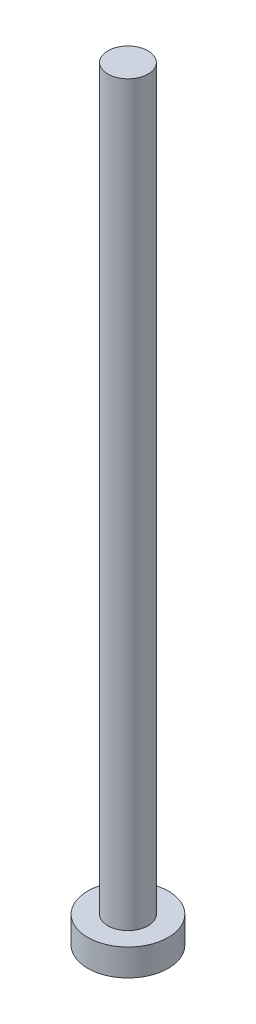
ISO-10303-21;
HEADER;
FILE_DESCRIPTION(('STEP AP214'),'2;1');
FILE_NAME('part.step','',(''),(''),'','','');
FILE_SCHEMA(('AUTOMOTIVE_DESIGN { 1 0 10303 214 1 1 1 1 }'));
ENDSEC;
DATA;
#1=APPLICATION_CONTEXT('core data for automotive mechanical design processes');
#2=APPLICATION_PROTOCOL_DEFINITION('international standard','automotive_design',2000,#1);
#3=PRODUCT_CONTEXT('',#1,'mechanical');
#4=PRODUCT('Part','Part','',(#3));
#5=PRODUCT_RELATED_PRODUCT_CATEGORY('part','',(#4));
#6=PRODUCT_DEFINITION_FORMATION('','',#4);
#7=PRODUCT_DEFINITION_CONTEXT('part definition',#1,'design');
#8=PRODUCT_DEFINITION('design','',#6,#7);
#9=PRODUCT_DEFINITION_SHAPE('','',#8);
#10=(LENGTH_UNIT() NAMED_UNIT(*) SI_UNIT(.MILLI.,.METRE.));
#11=(NAMED_UNIT(*) PLANE_ANGLE_UNIT() SI_UNIT($,.RADIAN.));
#12=(NAMED_UNIT(*) SI_UNIT($,.STERADIAN.) SOLID_ANGLE_UNIT());
#13=UNCERTAINTY_MEASURE_WITH_UNIT(LENGTH_MEASURE(1.E-05),#10,'distance_accuracy_value','');
#14=(GEOMETRIC_REPRESENTATION_CONTEXT(3) GLOBAL_UNCERTAINTY_ASSIGNED_CONTEXT((#13)) GLOBAL_UNIT_ASSIGNED_CONTEXT((#10,
#11,#12)) REPRESENTATION_CONTEXT('',''));
#15=CARTESIAN_POINT('',(0.,0.,0.));
#16=DIRECTION('',(0.,0.,1.));
#17=DIRECTION('',(1.,0.,0.));
#18=AXIS2_PLACEMENT_3D('',#15,#16,#17);
#19=CARTESIAN_POINT('',(37.8454585012872,-7.00000005030032,-40.));
#20=DIRECTION('',(-4.99382002763777E-12,-1.,8.11648050852432E-10));
#21=DIRECTION('',(0.,-8.11648050852432E-10,-1.));
#22=AXIS2_PLACEMENT_3D('',#19,#20,#21);
#23=PLANE('',#22);
#24=CARTESIAN_POINT('',(37.8454585012872,-7.00000005030033,-40.));
#25=DIRECTION('',(4.99398489789618E-12,1.,-8.11647698318666E-10));
#26=DIRECTION('',(0.,8.11647698318666E-10,1.));
#27=AXIS2_PLACEMENT_3D('',#24,#25,#26);
#28=CIRCLE('',#27,3.);
#29=CARTESIAN_POINT('',(37.8454585012872,-7.00000004786539,-37.));
#30=VERTEX_POINT('',#29);
#31=EDGE_CURVE('E18',#30,#30,#28,.T.);
#32=ORIENTED_EDGE('',*,*,#31,.F.);
#33=EDGE_LOOP('',(#32));
#34=FACE_BOUND('',#33,.T.);
#35=ADVANCED_FACE('F15',(#34),#23,.T.);
#36=CARTESIAN_POINT('',(37.8454585012872,-7.00000005030032,-40.));
#37=DIRECTION('',(4.99398489789618E-12,1.,-8.11647698318666E-10));
#38=DIRECTION('',(0.,8.11647698318666E-10,1.));
#39=AXIS2_PLACEMENT_3D('',#36,#37,#38);
#40=CYLINDRICAL_SURFACE('',#39,3.);
#41=ORIENTED_EDGE('',*,*,#31,.T.);
#42=EDGE_LOOP('',(#41));
#43=FACE_BOUND('',#42,.T.);
#44=CARTESIAN_POINT('',(37.8454585012972,-5.0000000010064,-40.0000000016233));
#45=DIRECTION('',(4.99398489789618E-12,1.,-8.11647698318666E-10));
#46=DIRECTION('',(0.,8.11647698318666E-10,1.));
#47=AXIS2_PLACEMENT_3D('',#44,#45,#46);
#48=CIRCLE('',#47,3.);
#49=CARTESIAN_POINT('',(37.8454585012972,-4.99999999857146,-37.0000000016233));
#50=VERTEX_POINT('',#49);
#51=EDGE_CURVE('E27',#50,#50,#48,.F.);
#52=ORIENTED_EDGE('',*,*,#51,.T.);
#53=EDGE_LOOP('',(#52));
#54=FACE_BOUND('',#53,.T.);
#55=ADVANCED_FACE('F35',(#43,#54),#40,.T.);
#56=CARTESIAN_POINT('',(37.8454585012873,-5.,-40.));
#57=DIRECTION('',(0.,-1.,0.));
#58=DIRECTION('',(1.,0.,0.));
#59=AXIS2_PLACEMENT_3D('',#56,#57,#58);
#60=PLANE('',#59);
#61=CARTESIAN_POINT('',(37.8454585010125,-5.0000000503002,-39.9999999553594));
#62=DIRECTION('',(-4.9937427930176E-12,-1.,8.11647960962215E-10));
#63=DIRECTION('',(0.,-8.11647960962215E-10,-1.));
#64=AXIS2_PLACEMENT_3D('',#61,#62,#63);
#65=CIRCLE('',#64,1.5);
#66=CARTESIAN_POINT('',(37.8454585010125,-5.00000005151767,-41.4999999553594));
#67=VERTEX_POINT('',#66);
#68=EDGE_CURVE('E22',#67,#67,#65,.F.);
#69=ORIENTED_EDGE('',*,*,#68,.F.);
#70=EDGE_LOOP('',(#69));
#71=FACE_BOUND('',#70,.T.);
#72=ORIENTED_EDGE('',*,*,#51,.F.);
#73=EDGE_LOOP('',(#72));
#74=FACE_BOUND('',#73,.T.);
#75=ADVANCED_FACE('F42',(#71,#74),#60,.F.);
#76=CARTESIAN_POINT('',(37.8454585012872,49.9999999496998,-40.));
#77=DIRECTION('',(4.99374296796846E-12,1.,-8.11647977994046E-10));
#78=DIRECTION('',(0.,8.11647977994046E-10,1.));
#79=AXIS2_PLACEMENT_3D('',#76,#77,#78);
#80=PLANE('',#79);
#81=CARTESIAN_POINT('',(37.8454585012872,49.9999999496998,-40.));
#82=DIRECTION('',(-4.9937427930176E-12,-1.,8.11647960962215E-10));
#83=DIRECTION('',(0.,-8.11647960962215E-10,-1.));
#84=AXIS2_PLACEMENT_3D('',#81,#82,#83);
#85=CIRCLE('',#84,1.5);
#86=CARTESIAN_POINT('',(37.8454585012872,49.9999999484823,-41.5));
#87=VERTEX_POINT('',#86);
#88=EDGE_CURVE('E10',#87,#87,#85,.T.);
#89=ORIENTED_EDGE('',*,*,#88,.F.);
#90=EDGE_LOOP('',(#89));
#91=FACE_BOUND('',#90,.T.);
#92=ADVANCED_FACE('F45',(#91),#80,.T.);
#93=CARTESIAN_POINT('',(37.8454585012872,49.9999999496998,-40.));
#94=DIRECTION('',(-4.9937427930176E-12,-1.,8.11647960962215E-10));
#95=DIRECTION('',(0.,-8.11647960962215E-10,-1.));
#96=AXIS2_PLACEMENT_3D('',#93,#94,#95);
#97=CYLINDRICAL_SURFACE('',#96,1.5);
#98=ORIENTED_EDGE('',*,*,#88,.T.);
#99=EDGE_LOOP('',(#98));
#100=FACE_BOUND('',#99,.T.);
#101=ORIENTED_EDGE('',*,*,#68,.T.);
#102=EDGE_LOOP('',(#101));
#103=FACE_BOUND('',#102,.T.);
#104=ADVANCED_FACE('F43',(#100,#103),#97,.T.);
#105=CLOSED_SHELL('',(#35,#55,#75,#92,#104));
#106=MANIFOLD_SOLID_BREP('B1',#105);
#107=ADVANCED_BREP_SHAPE_REPRESENTATION('',(#18,#106),#14);
#108=SHAPE_DEFINITION_REPRESENTATION(#9,#107);
ENDSEC;
END-ISO-10303-21;
